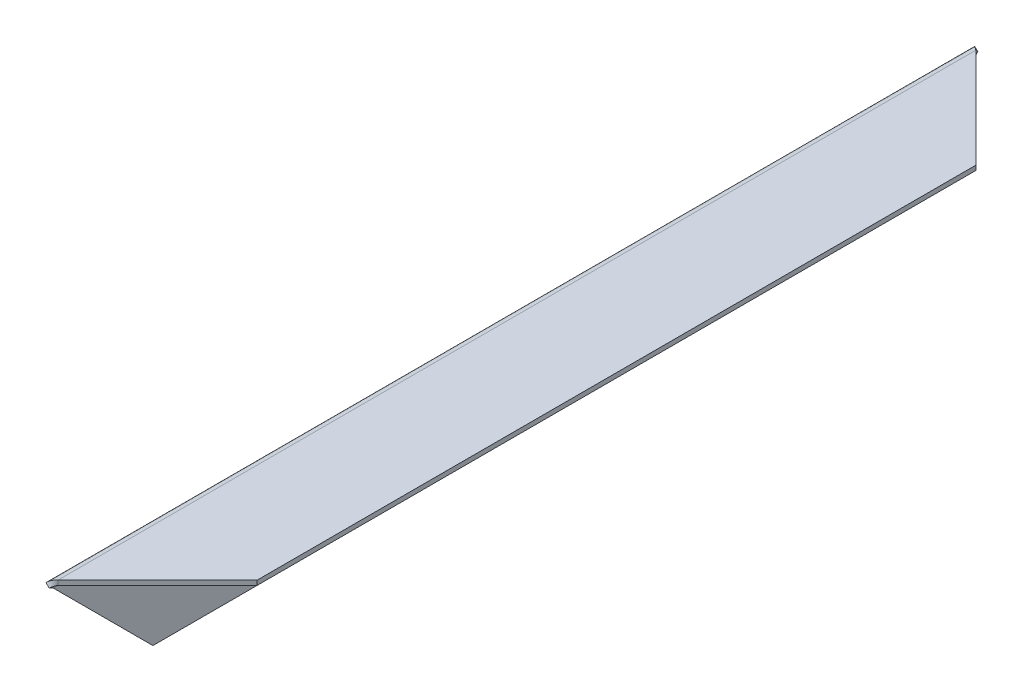
ISO-10303-21;
HEADER;
FILE_DESCRIPTION(('STEP AP214'),'2;1');
FILE_NAME('part.step','',(''),(''),'','','');
FILE_SCHEMA(('AUTOMOTIVE_DESIGN { 1 0 10303 214 1 1 1 1 }'));
ENDSEC;
DATA;
#1=APPLICATION_CONTEXT('core data for automotive mechanical design processes');
#2=APPLICATION_PROTOCOL_DEFINITION('international standard','automotive_design',2000,#1);
#3=PRODUCT_CONTEXT('',#1,'mechanical');
#4=PRODUCT('Part','Part','',(#3));
#5=PRODUCT_RELATED_PRODUCT_CATEGORY('part','',(#4));
#6=PRODUCT_DEFINITION_FORMATION('','',#4);
#7=PRODUCT_DEFINITION_CONTEXT('part definition',#1,'design');
#8=PRODUCT_DEFINITION('design','',#6,#7);
#9=PRODUCT_DEFINITION_SHAPE('','',#8);
#10=(LENGTH_UNIT() NAMED_UNIT(*) SI_UNIT(.MILLI.,.METRE.));
#11=(NAMED_UNIT(*) PLANE_ANGLE_UNIT() SI_UNIT($,.RADIAN.));
#12=(NAMED_UNIT(*) SI_UNIT($,.STERADIAN.) SOLID_ANGLE_UNIT());
#13=UNCERTAINTY_MEASURE_WITH_UNIT(LENGTH_MEASURE(1.E-05),#10,'distance_accuracy_value','');
#14=(GEOMETRIC_REPRESENTATION_CONTEXT(3) GLOBAL_UNCERTAINTY_ASSIGNED_CONTEXT((#13)) GLOBAL_UNIT_ASSIGNED_CONTEXT((#10,
#11,#12)) REPRESENTATION_CONTEXT('',''));
#15=CARTESIAN_POINT('',(0.,0.,0.));
#16=DIRECTION('',(0.,0.,1.));
#17=DIRECTION('',(1.,0.,0.));
#18=AXIS2_PLACEMENT_3D('',#15,#16,#17);
#19=CARTESIAN_POINT('',(-75.3461789999995,0.188336430725022,0.));
#20=DIRECTION('',(-1.,0.,0.));
#21=DIRECTION('',(0.,0.,1.));
#22=AXIS2_PLACEMENT_3D('',#19,#20,#21);
#23=PLANE('',#22);
#24=DIRECTION('',(0.,-0.707106781186615,-0.70710678118648));
#25=VECTOR('',#24,1.);
#26=CARTESIAN_POINT('',(-75.346179,74.7407654307376,74.5524289999984));
#27=LINE('',#26,#25);
#28=CARTESIAN_POINT('',(-75.346179,73.8729789999997,73.6846425692607));
#29=VERTEX_POINT('',#28);
#30=CARTESIAN_POINT('',(-75.3461789999999,57.8815154307375,57.6931790000015));
#31=VERTEX_POINT('',#30);
#32=EDGE_CURVE('E36',#29,#31,#27,.T.);
#33=ORIENTED_EDGE('',*,*,#32,.F.);
#34=DIRECTION('',(0.,0.,-1.));
#35=VECTOR('',#34,1.);
#36=CARTESIAN_POINT('',(-75.346179,73.8729789999997,0.));
#37=LINE('',#36,#35);
#38=CARTESIAN_POINT('',(-75.346179,73.8729789999998,-73.6846425692606));
#39=VERTEX_POINT('',#38);
#40=EDGE_CURVE('E29',#29,#39,#37,.T.);
#41=ORIENTED_EDGE('',*,*,#40,.T.);
#42=DIRECTION('',(0.,0.707106781186615,-0.70710678118648));
#43=VECTOR('',#42,1.);
#44=CARTESIAN_POINT('',(-75.346179,74.7407654307376,-74.5524289999983));
#45=LINE('',#44,#43);
#46=CARTESIAN_POINT('',(-75.3461789999999,57.8815154307376,-57.6931790000015));
#47=VERTEX_POINT('',#46);
#48=EDGE_CURVE('E44',#47,#39,#45,.T.);
#49=ORIENTED_EDGE('',*,*,#48,.F.);
#50=DIRECTION('',(0.,0.,-1.));
#51=VECTOR('',#50,1.);
#52=CARTESIAN_POINT('',(-75.3461789999999,57.8815154307375,57.6931790000015));
#53=LINE('',#52,#51);
#54=EDGE_CURVE('E414',#31,#47,#53,.T.);
#55=ORIENTED_EDGE('',*,*,#54,.F.);
#56=EDGE_LOOP('',(#33,#41,#49,#55));
#57=FACE_BOUND('',#56,.T.);
#58=ADVANCED_FACE('F17',(#57),#23,.T.);
#59=CARTESIAN_POINT('',(-74.6095790000001,74.7407654307376,74.5524289999984));
#60=DIRECTION('',(0.,0.70710678118648,-0.707106781186615));
#61=DIRECTION('',(0.,0.707106781186615,0.70710678118648));
#62=AXIS2_PLACEMENT_3D('',#59,#60,#61);
#63=PLANE('',#62);
#64=CARTESIAN_POINT('',(-75.346179,73.8729789999997,73.6846425692607));
#65=CARTESIAN_POINT('',(-74.6095790000001,73.8729789999997,73.6846425692607));
#66=B_SPLINE_CURVE_WITH_KNOTS('',1,(#64,#65),.UNSPECIFIED.,.F.,.F.,(2,2),(0.,1.),.UNSPECIFIED.);
#67=CARTESIAN_POINT('',(-74.6095790000001,73.8729789999997,73.6846425692607));
#68=VERTEX_POINT('',#67);
#69=EDGE_CURVE('E11',#29,#68,#66,.T.);
#70=ORIENTED_EDGE('',*,*,#69,.F.);
#71=ORIENTED_EDGE('',*,*,#32,.T.);
#72=DIRECTION('',(-1.,0.,0.));
#73=VECTOR('',#72,1.);
#74=CARTESIAN_POINT('',(-74.6095789999999,57.8815154307375,57.6931790000015));
#75=LINE('',#74,#73);
#76=CARTESIAN_POINT('',(-74.6095789999999,57.8815154307375,57.6931790000015));
#77=VERTEX_POINT('',#76);
#78=EDGE_CURVE('E457',#77,#31,#75,.T.);
#79=ORIENTED_EDGE('',*,*,#78,.F.);
#80=DIRECTION('',(0.,-0.707106781186615,-0.70710678118648));
#81=VECTOR('',#80,1.);
#82=CARTESIAN_POINT('',(-74.6095790000001,74.7407654307376,74.5524289999984));
#83=LINE('',#82,#81);
#84=EDGE_CURVE('E260',#68,#77,#83,.T.);
#85=ORIENTED_EDGE('',*,*,#84,.F.);
#86=EDGE_LOOP('',(#70,#71,#79,#85));
#87=FACE_BOUND('',#86,.T.);
#88=ADVANCED_FACE('F19',(#87),#63,.F.);
#89=CARTESIAN_POINT('',(-74.6095789999999,57.8815154307375,57.6931790000015));
#90=DIRECTION('',(0.,1.,0.));
#91=DIRECTION('',(0.,0.,1.));
#92=AXIS2_PLACEMENT_3D('',#89,#90,#91);
#93=PLANE('',#92);
#94=ORIENTED_EDGE('',*,*,#54,.T.);
#95=DIRECTION('',(-1.,0.,0.));
#96=VECTOR('',#95,1.);
#97=CARTESIAN_POINT('',(-74.6095789999999,57.8815154307376,-57.6931790000015));
#98=LINE('',#97,#96);
#99=CARTESIAN_POINT('',(-74.6095789999999,57.8815154307376,-57.6931790000015));
#100=VERTEX_POINT('',#99);
#101=EDGE_CURVE('E455',#100,#47,#98,.T.);
#102=ORIENTED_EDGE('',*,*,#101,.F.);
#103=DIRECTION('',(0.,0.,-1.));
#104=VECTOR('',#103,1.);
#105=CARTESIAN_POINT('',(-74.6095789999999,57.8815154307375,57.6931790000015));
#106=LINE('',#105,#104);
#107=EDGE_CURVE('E453',#77,#100,#106,.T.);
#108=ORIENTED_EDGE('',*,*,#107,.F.);
#109=ORIENTED_EDGE('',*,*,#78,.T.);
#110=EDGE_LOOP('',(#94,#102,#108,#109));
#111=FACE_BOUND('',#110,.T.);
#112=ADVANCED_FACE('F235',(#111),#93,.F.);
#113=CARTESIAN_POINT('',(-74.609579,74.7407654307376,-74.5524289999983));
#114=DIRECTION('',(0.,0.70710678118648,0.707106781186615));
#115=DIRECTION('',(0.,-0.707106781186615,0.70710678118648));
#116=AXIS2_PLACEMENT_3D('',#113,#114,#115);
#117=PLANE('',#116);
#118=CARTESIAN_POINT('',(-74.609579,73.8729789999998,-73.6846425692607));
#119=CARTESIAN_POINT('',(-75.346179,73.8729789999998,-73.6846425692607));
#120=B_SPLINE_CURVE_WITH_KNOTS('',1,(#118,#119),.UNSPECIFIED.,.F.,.F.,(2,2),(0.,1.),.UNSPECIFIED.);
#121=CARTESIAN_POINT('',(-74.609579,73.8729789999998,-73.6846425692607));
#122=VERTEX_POINT('',#121);
#123=EDGE_CURVE('E272',#122,#39,#120,.T.);
#124=ORIENTED_EDGE('',*,*,#123,.F.);
#125=DIRECTION('',(0.,0.707106781186615,-0.70710678118648));
#126=VECTOR('',#125,1.);
#127=CARTESIAN_POINT('',(-74.609579,74.7407654307376,-74.5524289999983));
#128=LINE('',#127,#126);
#129=EDGE_CURVE('E450',#100,#122,#128,.T.);
#130=ORIENTED_EDGE('',*,*,#129,.F.);
#131=ORIENTED_EDGE('',*,*,#101,.T.);
#132=ORIENTED_EDGE('',*,*,#48,.T.);
#133=EDGE_LOOP('',(#124,#130,#131,#132));
#134=FACE_BOUND('',#133,.T.);
#135=ADVANCED_FACE('F238',(#134),#117,.F.);
#136=CARTESIAN_POINT('',(-74.6095789999995,0.188336430725022,0.));
#137=DIRECTION('',(-1.,0.,0.));
#138=DIRECTION('',(0.,0.,1.));
#139=AXIS2_PLACEMENT_3D('',#136,#137,#138);
#140=PLANE('',#139);
#141=DIRECTION('',(0.,0.,-1.));
#142=VECTOR('',#141,1.);
#143=CARTESIAN_POINT('',(-74.609579,73.8729789999997,0.));
#144=LINE('',#143,#142);
#145=EDGE_CURVE('E451',#68,#122,#144,.T.);
#146=ORIENTED_EDGE('',*,*,#145,.F.);
#147=ORIENTED_EDGE('',*,*,#84,.T.);
#148=ORIENTED_EDGE('',*,*,#107,.T.);
#149=ORIENTED_EDGE('',*,*,#129,.T.);
#150=EDGE_LOOP('',(#146,#147,#148,#149));
#151=FACE_BOUND('',#150,.T.);
#152=ADVANCED_FACE('F240',(#151),#140,.F.);
#153=CARTESIAN_POINT('',(-57.8815154307379,74.6095789999998,57.6931790000015));
#154=DIRECTION('',(-1.,0.,0.));
#155=DIRECTION('',(0.,0.,-1.));
#156=AXIS2_PLACEMENT_3D('',#153,#154,#155);
#157=PLANE('',#156);
#158=DIRECTION('',(0.,0.,1.));
#159=VECTOR('',#158,1.);
#160=CARTESIAN_POINT('',(-57.8815154307379,75.3461789999998,57.6931790000015));
#161=LINE('',#160,#159);
#162=CARTESIAN_POINT('',(-57.8815154307379,75.3461789999998,-57.6931790000015));
#163=VERTEX_POINT('',#162);
#164=CARTESIAN_POINT('',(-57.8815154307379,75.3461789999998,57.6931790000015));
#165=VERTEX_POINT('',#164);
#166=EDGE_CURVE('E383',#163,#165,#161,.T.);
#167=ORIENTED_EDGE('',*,*,#166,.T.);
#168=DIRECTION('',(0.,1.,0.));
#169=VECTOR('',#168,1.);
#170=CARTESIAN_POINT('',(-57.8815154307379,74.6095789999998,57.6931790000015));
#171=LINE('',#170,#169);
#172=CARTESIAN_POINT('',(-57.8815154307379,74.6095789999998,57.6931790000015));
#173=VERTEX_POINT('',#172);
#174=EDGE_CURVE('E411',#173,#165,#171,.T.);
#175=ORIENTED_EDGE('',*,*,#174,.F.);
#176=DIRECTION('',(0.,0.,1.));
#177=VECTOR('',#176,1.);
#178=CARTESIAN_POINT('',(-57.8815154307379,74.6095789999998,57.6931790000015));
#179=LINE('',#178,#177);
#180=CARTESIAN_POINT('',(-57.8815154307379,74.6095789999998,-57.6931790000015));
#181=VERTEX_POINT('',#180);
#182=EDGE_CURVE('E202',#181,#173,#179,.T.);
#183=ORIENTED_EDGE('',*,*,#182,.F.);
#184=DIRECTION('',(0.,1.,0.));
#185=VECTOR('',#184,1.);
#186=CARTESIAN_POINT('',(-57.8815154307379,74.6095789999998,-57.6931790000015));
#187=LINE('',#186,#185);
#188=EDGE_CURVE('E200',#181,#163,#187,.T.);
#189=ORIENTED_EDGE('',*,*,#188,.T.);
#190=EDGE_LOOP('',(#167,#175,#183,#189));
#191=FACE_BOUND('',#190,.T.);
#192=ADVANCED_FACE('F242',(#191),#157,.F.);
#193=CARTESIAN_POINT('',(-149.29319443075,74.6095789999995,0.));
#194=DIRECTION('',(0.,1.,0.));
#195=DIRECTION('',(0.,0.,1.));
#196=AXIS2_PLACEMENT_3D('',#193,#194,#195);
#197=PLANE('',#196);
#198=DIRECTION('',(-0.707106781186614,0.,0.707106781186481));
#199=VECTOR('',#198,1.);
#200=CARTESIAN_POINT('',(-74.7407654307379,74.6095789999997,74.5524289999984));
#201=LINE('',#200,#199);
#202=CARTESIAN_POINT('',(-73.872979,74.6095789999997,73.6846425692607));
#203=VERTEX_POINT('',#202);
#204=EDGE_CURVE('E191',#173,#203,#201,.T.);
#205=ORIENTED_EDGE('',*,*,#204,.T.);
#206=DIRECTION('',(0.,0.,-1.));
#207=VECTOR('',#206,1.);
#208=CARTESIAN_POINT('',(-73.872979,74.6095789999997,0.));
#209=LINE('',#208,#207);
#210=CARTESIAN_POINT('',(-73.872979,74.6095789999998,-73.6846425692607));
#211=VERTEX_POINT('',#210);
#212=EDGE_CURVE('E133',#203,#211,#209,.T.);
#213=ORIENTED_EDGE('',*,*,#212,.T.);
#214=DIRECTION('',(0.707106781186614,0.,0.707106781186481));
#215=VECTOR('',#214,1.);
#216=CARTESIAN_POINT('',(-74.7407654307379,74.6095789999998,-74.5524289999983));
#217=LINE('',#216,#215);
#218=EDGE_CURVE('E188',#211,#181,#217,.T.);
#219=ORIENTED_EDGE('',*,*,#218,.T.);
#220=ORIENTED_EDGE('',*,*,#182,.T.);
#221=EDGE_LOOP('',(#205,#213,#219,#220));
#222=FACE_BOUND('',#221,.T.);
#223=ADVANCED_FACE('F187',(#222),#197,.F.);
#224=CARTESIAN_POINT('',(-74.7407654307379,74.6095789999998,-74.5524289999983));
#225=DIRECTION('',(-0.707106781186481,0.,0.707106781186614));
#226=DIRECTION('',(-0.707106781186614,0.,-0.707106781186481));
#227=AXIS2_PLACEMENT_3D('',#224,#225,#226);
#228=PLANE('',#227);
#229=ORIENTED_EDGE('',*,*,#218,.F.);
#230=CARTESIAN_POINT('',(-73.872979,75.3461789999998,-73.6846425692607));
#231=CARTESIAN_POINT('',(-73.872979,74.6095789999998,-73.6846425692607));
#232=B_SPLINE_CURVE_WITH_KNOTS('',1,(#230,#231),.UNSPECIFIED.,.F.,.F.,(2,2),(0.,1.),.UNSPECIFIED.);
#233=CARTESIAN_POINT('',(-73.872979,75.3461789999998,-73.6846425692606));
#234=VERTEX_POINT('',#233);
#235=EDGE_CURVE('E197',#211,#234,#232,.F.);
#236=ORIENTED_EDGE('',*,*,#235,.T.);
#237=DIRECTION('',(0.707106781186614,0.,0.707106781186481));
#238=VECTOR('',#237,1.);
#239=CARTESIAN_POINT('',(-74.7407654307379,75.3461789999998,-74.5524289999983));
#240=LINE('',#239,#238);
#241=EDGE_CURVE('E386',#234,#163,#240,.T.);
#242=ORIENTED_EDGE('',*,*,#241,.T.);
#243=ORIENTED_EDGE('',*,*,#188,.F.);
#244=EDGE_LOOP('',(#229,#236,#242,#243));
#245=FACE_BOUND('',#244,.T.);
#246=ADVANCED_FACE('F196',(#245),#228,.F.);
#247=CARTESIAN_POINT('',(-149.29319443075,75.3461789999995,0.));
#248=DIRECTION('',(0.,1.,0.));
#249=DIRECTION('',(0.,0.,1.));
#250=AXIS2_PLACEMENT_3D('',#247,#248,#249);
#251=PLANE('',#250);
#252=DIRECTION('',(0.,0.,-1.));
#253=VECTOR('',#252,1.);
#254=CARTESIAN_POINT('',(-73.872979,75.3461789999998,0.));
#255=LINE('',#254,#253);
#256=CARTESIAN_POINT('',(-73.8729790000001,75.3461789999997,73.6846425692607));
#257=VERTEX_POINT('',#256);
#258=EDGE_CURVE('E114',#257,#234,#255,.T.);
#259=ORIENTED_EDGE('',*,*,#258,.F.);
#260=DIRECTION('',(-0.707106781186614,0.,0.707106781186481));
#261=VECTOR('',#260,1.);
#262=CARTESIAN_POINT('',(-74.7407654307379,75.3461789999997,74.5524289999984));
#263=LINE('',#262,#261);
#264=EDGE_CURVE('E221',#165,#257,#263,.T.);
#265=ORIENTED_EDGE('',*,*,#264,.F.);
#266=ORIENTED_EDGE('',*,*,#166,.F.);
#267=ORIENTED_EDGE('',*,*,#241,.F.);
#268=EDGE_LOOP('',(#259,#265,#266,#267));
#269=FACE_BOUND('',#268,.T.);
#270=ADVANCED_FACE('F233',(#269),#251,.T.);
#271=CARTESIAN_POINT('',(-74.7407654307379,74.6095789999997,74.5524289999984));
#272=DIRECTION('',(-0.707106781186481,0.,-0.707106781186614));
#273=DIRECTION('',(0.707106781186614,0.,-0.707106781186481));
#274=AXIS2_PLACEMENT_3D('',#271,#272,#273);
#275=PLANE('',#274);
#276=ORIENTED_EDGE('',*,*,#264,.T.);
#277=CARTESIAN_POINT('',(-73.872979,74.6095789999997,73.6846425692607));
#278=CARTESIAN_POINT('',(-73.8729790000001,75.3461789999997,73.6846425692607));
#279=B_SPLINE_CURVE_WITH_KNOTS('',1,(#277,#278),.UNSPECIFIED.,.F.,.F.,(2,2),(0.,1.),.UNSPECIFIED.);
#280=EDGE_CURVE('E216',#257,#203,#279,.F.);
#281=ORIENTED_EDGE('',*,*,#280,.T.);
#282=ORIENTED_EDGE('',*,*,#204,.F.);
#283=ORIENTED_EDGE('',*,*,#174,.T.);
#284=EDGE_LOOP('',(#276,#281,#282,#283));
#285=FACE_BOUND('',#284,.T.);
#286=ADVANCED_FACE('F223',(#285),#275,.F.);
#287=CARTESIAN_POINT('',(-74.9146887100441,74.9146887100437,74.5524289999984));
#288=CARTESIAN_POINT('',(-75.0510639267768,74.778313493311,74.4077812391921));
#289=CARTESIAN_POINT('',(-75.1602411073236,74.6149104818821,74.2631668564191));
#290=CARTESIAN_POINT('',(-75.3078355472678,74.2585859832378,73.9739047128399));
#291=CARTESIAN_POINT('',(-75.346179,74.0658426810747,73.8292903300669));
#292=CARTESIAN_POINT('',(-75.346179,73.8729789999997,73.6846425692607));
#293=CARTESIAN_POINT('',(-74.3938338550221,74.3938338550217,74.5524289999984));
#294=CARTESIAN_POINT('',(-74.4620173784557,74.3256503315881,74.4077899046431));
#295=CARTESIAN_POINT('',(-74.5166100536618,74.2439447409409,74.2631668564191));
#296=CARTESIAN_POINT('',(-74.5904072736339,74.0657824916188,73.9739047128399));
#297=CARTESIAN_POINT('',(-74.6095790000001,73.9694050635699,73.829281664616));
#298=CARTESIAN_POINT('',(-74.6095790000001,73.8729789999997,73.6846425692607));
#299=B_SPLINE_SURFACE_WITH_KNOTS('',1,3,((#287,#288,#289,#290,#291,#292),(#293,#294,#295,#296,
#297,#298)),.UNSPECIFIED.,.F.,.F.,.F.,(2,2),(4,2,4),(0.,1.),(0.,0.5,1.),.UNSPECIFIED.);
#300=CARTESIAN_POINT('',(-74.9146887100441,74.9146887100437,74.5524289999984));
#301=CARTESIAN_POINT('',(-74.3938338550221,74.3938338550217,74.5524289999984));
#302=B_SPLINE_CURVE_WITH_KNOTS('',1,(#300,#301),.UNSPECIFIED.,.F.,.F.,(2,2),(0.,1.),.UNSPECIFIED.);
#303=CARTESIAN_POINT('',(-74.9146889457465,74.9146884743413,74.5524287499982));
#304=VERTEX_POINT('',#303);
#305=CARTESIAN_POINT('',(-74.3938338550221,74.3938338550217,74.5524289999984));
#306=VERTEX_POINT('',#305);
#307=EDGE_CURVE('E99',#304,#306,#302,.T.);
#308=CARTESIAN_POINT('',(-74.9146887100441,74.9146887100437,74.5524289999984));
#309=CARTESIAN_POINT('',(-75.0510639267768,74.778313493311,74.4077812391921));
#310=CARTESIAN_POINT('',(-75.1602411073236,74.6149104818821,74.2631668564191));
#311=CARTESIAN_POINT('',(-75.3078355472678,74.2585859832378,73.9739047128399));
#312=CARTESIAN_POINT('',(-75.346179,74.0658426810747,73.8292903300669));
#313=CARTESIAN_POINT('',(-75.346179,73.8729789999997,73.6846425692607));
#314=B_SPLINE_CURVE_WITH_KNOTS('',3,(#308,#309,#310,#311,#312,#313),.UNSPECIFIED.,.F.,.F.,(4,2,
4),(0.,0.5,1.),.UNSPECIFIED.);
#315=EDGE_CURVE('E266',#304,#29,#314,.T.);
#316=CARTESIAN_POINT('',(-74.6095790000001,73.8729789999997,73.6846425692607));
#317=CARTESIAN_POINT('',(-74.6095790000001,73.9694050635699,73.829281664616));
#318=CARTESIAN_POINT('',(-74.5904072736339,74.0657824916188,73.9739047128399));
#319=CARTESIAN_POINT('',(-74.5166100536618,74.2439447409409,74.2631668564191));
#320=CARTESIAN_POINT('',(-74.4620173784557,74.3256503315881,74.4077899046431));
#321=CARTESIAN_POINT('',(-74.3938338550221,74.3938338550217,74.5524289999984));
#322=B_SPLINE_CURVE_WITH_KNOTS('',3,(#316,#317,#318,#319,#320,#321),.UNSPECIFIED.,.F.,.F.,(4,2,
4),(0.,0.5,1.),.UNSPECIFIED.);
#323=EDGE_CURVE('E119',#306,#68,#322,.F.);
#324=ORIENTED_EDGE('',*,*,#307,.F.);
#325=ORIENTED_EDGE('',*,*,#315,.T.);
#326=ORIENTED_EDGE('',*,*,#69,.T.);
#327=ORIENTED_EDGE('',*,*,#323,.F.);
#328=EDGE_LOOP('',(#324,#325,#326,#327));
#329=FACE_BOUND('',#328,.T.);
#330=ADVANCED_FACE('F121',(#329),#299,.F.);
#331=CARTESIAN_POINT('',(-75.346179,73.8729789999998,-73.6846425692607));
#332=CARTESIAN_POINT('',(-75.346179,74.0658426810747,-73.8292903300669));
#333=CARTESIAN_POINT('',(-75.3078355472678,74.2585859832379,-73.9739047128399));
#334=CARTESIAN_POINT('',(-75.1602411073235,74.6149104818822,-74.2631668564191));
#335=CARTESIAN_POINT('',(-75.0510639267768,74.7783134933111,-74.4077812391921));
#336=CARTESIAN_POINT('',(-74.9146887100441,74.9146887100438,-74.5524289999983));
#337=CARTESIAN_POINT('',(-74.609579,73.8729789999998,-73.6846425692607));
#338=CARTESIAN_POINT('',(-74.609579,73.96940506357,-73.829281664616));
#339=CARTESIAN_POINT('',(-74.5904072736339,74.0657824916188,-73.9739047128399));
#340=CARTESIAN_POINT('',(-74.5166100536618,74.243944740941,-74.2631668564191));
#341=CARTESIAN_POINT('',(-74.4620173784557,74.3256503315882,-74.407789904643));
#342=CARTESIAN_POINT('',(-74.3938338550221,74.3938338550218,-74.5524289999983));
#343=B_SPLINE_SURFACE_WITH_KNOTS('',1,3,((#331,#332,#333,#334,#335,#336),(#337,#338,#339,#340,
#341,#342)),.UNSPECIFIED.,.F.,.F.,.F.,(2,2),(4,2,4),(0.,1.),(0.,0.5,1.),.UNSPECIFIED.);
#344=CARTESIAN_POINT('',(-75.346179,73.8729789999998,-73.6846425692607));
#345=CARTESIAN_POINT('',(-75.346179,74.0658426810747,-73.8292903300669));
#346=CARTESIAN_POINT('',(-75.3078355472678,74.2585859832379,-73.9739047128399));
#347=CARTESIAN_POINT('',(-75.1602411073235,74.6149104818822,-74.2631668564191));
#348=CARTESIAN_POINT('',(-75.0510639267768,74.7783134933111,-74.4077812391921));
#349=CARTESIAN_POINT('',(-74.9146887100441,74.9146887100438,-74.5524289999983));
#350=B_SPLINE_CURVE_WITH_KNOTS('',3,(#344,#345,#346,#347,#348,#349),.UNSPECIFIED.,.F.,.F.,(4,2,
4),(0.,0.5,1.),.UNSPECIFIED.);
#351=CARTESIAN_POINT('',(-74.9146889457464,74.9146884743413,-74.5524287499982));
#352=VERTEX_POINT('',#351);
#353=EDGE_CURVE('E269',#39,#352,#350,.T.);
#354=CARTESIAN_POINT('',(-74.9146887100441,74.9146887100438,-74.5524289999983));
#355=CARTESIAN_POINT('',(-74.3938338550221,74.3938338550218,-74.5524289999983));
#356=B_SPLINE_CURVE_WITH_KNOTS('',1,(#354,#355),.UNSPECIFIED.,.F.,.F.,(2,2),(0.,1.),.UNSPECIFIED.);
#357=CARTESIAN_POINT('',(-74.3938338550221,74.3938338550218,-74.5524289999983));
#358=VERTEX_POINT('',#357);
#359=EDGE_CURVE('E115',#352,#358,#356,.T.);
#360=CARTESIAN_POINT('',(-74.3938338550221,74.3938338550218,-74.5524289999983));
#361=CARTESIAN_POINT('',(-74.4620173784557,74.3256503315882,-74.407789904643));
#362=CARTESIAN_POINT('',(-74.5166100536618,74.243944740941,-74.2631668564191));
#363=CARTESIAN_POINT('',(-74.5904072736339,74.0657824916188,-73.9739047128399));
#364=CARTESIAN_POINT('',(-74.609579,73.96940506357,-73.829281664616));
#365=CARTESIAN_POINT('',(-74.609579,73.8729789999998,-73.6846425692607));
#366=B_SPLINE_CURVE_WITH_KNOTS('',3,(#360,#361,#362,#363,#364,#365),.UNSPECIFIED.,.F.,.F.,(4,2,
4),(0.,0.5,1.),.UNSPECIFIED.);
#367=EDGE_CURVE('E126',#122,#358,#366,.F.);
#368=ORIENTED_EDGE('',*,*,#123,.T.);
#369=ORIENTED_EDGE('',*,*,#353,.T.);
#370=ORIENTED_EDGE('',*,*,#359,.T.);
#371=ORIENTED_EDGE('',*,*,#367,.F.);
#372=EDGE_LOOP('',(#368,#369,#370,#371));
#373=FACE_BOUND('',#372,.T.);
#374=ADVANCED_FACE('F287',(#373),#343,.F.);
#375=CARTESIAN_POINT('',(-74.9146887100441,74.9146887100438,-74.5524289999983));
#376=CARTESIAN_POINT('',(-74.7783134933113,75.0510639267765,-74.4077812391921));
#377=CARTESIAN_POINT('',(-74.6149104818825,75.1602411073232,-74.2631668564191));
#378=CARTESIAN_POINT('',(-74.2585859832381,75.3078355472675,-73.9739047128399));
#379=CARTESIAN_POINT('',(-74.065842681075,75.3461789999998,-73.8292903300669));
#380=CARTESIAN_POINT('',(-73.872979,75.3461789999998,-73.6846425692607));
#381=CARTESIAN_POINT('',(-74.3938338550221,74.3938338550218,-74.5524289999983));
#382=CARTESIAN_POINT('',(-74.3256503315884,74.4620173784554,-74.407789904643));
#383=CARTESIAN_POINT('',(-74.2439447409412,74.5166100536615,-74.2631668564191));
#384=CARTESIAN_POINT('',(-74.0657824916191,74.5904072736337,-73.9739047128399));
#385=CARTESIAN_POINT('',(-73.9694050635702,74.6095789999998,-73.8292816646159));
#386=CARTESIAN_POINT('',(-73.872979,74.6095789999998,-73.6846425692607));
#387=B_SPLINE_SURFACE_WITH_KNOTS('',1,3,((#375,#376,#377,#378,#379,#380),(#381,#382,#383,#384,
#385,#386)),.UNSPECIFIED.,.F.,.F.,.F.,(2,2),(4,2,4),(0.,1.),(0.,0.5,1.),.UNSPECIFIED.);
#388=CARTESIAN_POINT('',(-74.9146887100441,74.9146887100438,-74.5524289999983));
#389=CARTESIAN_POINT('',(-74.7783134933113,75.0510639267765,-74.4077812391921));
#390=CARTESIAN_POINT('',(-74.6149104818825,75.1602411073232,-74.2631668564191));
#391=CARTESIAN_POINT('',(-74.2585859832381,75.3078355472675,-73.9739047128399));
#392=CARTESIAN_POINT('',(-74.065842681075,75.3461789999998,-73.8292903300669));
#393=CARTESIAN_POINT('',(-73.872979,75.3461789999998,-73.6846425692607));
#394=B_SPLINE_CURVE_WITH_KNOTS('',3,(#388,#389,#390,#391,#392,#393),.UNSPECIFIED.,.F.,.F.,(4,2,
4),(0.,0.5,1.),.UNSPECIFIED.);
#395=EDGE_CURVE('E370',#352,#234,#394,.T.);
#396=CARTESIAN_POINT('',(-73.872979,74.6095789999998,-73.6846425692607));
#397=CARTESIAN_POINT('',(-73.9694050635702,74.6095789999998,-73.8292816646159));
#398=CARTESIAN_POINT('',(-74.0657824916191,74.5904072736337,-73.9739047128399));
#399=CARTESIAN_POINT('',(-74.2439447409412,74.5166100536615,-74.2631668564191));
#400=CARTESIAN_POINT('',(-74.3256503315884,74.4620173784554,-74.407789904643));
#401=CARTESIAN_POINT('',(-74.3938338550221,74.3938338550218,-74.5524289999983));
#402=B_SPLINE_CURVE_WITH_KNOTS('',3,(#396,#397,#398,#399,#400,#401),.UNSPECIFIED.,.F.,.F.,(4,2,
4),(0.,0.5,1.),.UNSPECIFIED.);
#403=EDGE_CURVE('E134',#358,#211,#402,.F.);
#404=ORIENTED_EDGE('',*,*,#359,.F.);
#405=ORIENTED_EDGE('',*,*,#395,.T.);
#406=ORIENTED_EDGE('',*,*,#235,.F.);
#407=ORIENTED_EDGE('',*,*,#403,.F.);
#408=EDGE_LOOP('',(#404,#405,#406,#407));
#409=FACE_BOUND('',#408,.T.);
#410=ADVANCED_FACE('F157',(#409),#387,.F.);
#411=CARTESIAN_POINT('',(-73.8729790000001,75.3461789999997,73.6846425692607));
#412=CARTESIAN_POINT('',(-74.065842681075,75.3461789999997,73.8292903300669));
#413=CARTESIAN_POINT('',(-74.2585859832381,75.3078355472675,73.9739047128399));
#414=CARTESIAN_POINT('',(-74.6149104818825,75.1602411073232,74.2631668564191));
#415=CARTESIAN_POINT('',(-74.7783134933114,75.0510639267765,74.4077812391921));
#416=CARTESIAN_POINT('',(-74.9146887100441,74.9146887100437,74.5524289999984));
#417=CARTESIAN_POINT('',(-73.872979,74.6095789999997,73.6846425692607));
#418=CARTESIAN_POINT('',(-73.9694050635703,74.6095789999997,73.829281664616));
#419=CARTESIAN_POINT('',(-74.0657824916191,74.5904072736336,73.9739047128399));
#420=CARTESIAN_POINT('',(-74.2439447409413,74.5166100536615,74.2631668564191));
#421=CARTESIAN_POINT('',(-74.3256503315884,74.4620173784554,74.4077899046431));
#422=CARTESIAN_POINT('',(-74.3938338550221,74.3938338550217,74.5524289999984));
#423=B_SPLINE_SURFACE_WITH_KNOTS('',1,3,((#411,#412,#413,#414,#415,#416),(#417,#418,#419,#420,
#421,#422)),.UNSPECIFIED.,.F.,.F.,.F.,(2,2),(4,2,4),(0.,1.),(0.,0.5,1.),.UNSPECIFIED.);
#424=CARTESIAN_POINT('',(-73.8729790000001,75.3461789999997,73.6846425692607));
#425=CARTESIAN_POINT('',(-74.065842681075,75.3461789999997,73.8292903300669));
#426=CARTESIAN_POINT('',(-74.2585859832381,75.3078355472675,73.9739047128399));
#427=CARTESIAN_POINT('',(-74.6149104818825,75.1602411073232,74.2631668564191));
#428=CARTESIAN_POINT('',(-74.7783134933114,75.0510639267765,74.4077812391921));
#429=CARTESIAN_POINT('',(-74.9146887100441,74.9146887100437,74.5524289999984));
#430=B_SPLINE_CURVE_WITH_KNOTS('',3,(#424,#425,#426,#427,#428,#429),.UNSPECIFIED.,.F.,.F.,(4,2,
4),(0.,0.5,1.),.UNSPECIFIED.);
#431=EDGE_CURVE('E108',#257,#304,#430,.T.);
#432=CARTESIAN_POINT('',(-74.3938338550221,74.3938338550217,74.5524289999984));
#433=CARTESIAN_POINT('',(-74.3256503315884,74.4620173784554,74.4077899046431));
#434=CARTESIAN_POINT('',(-74.2439447409413,74.5166100536615,74.2631668564191));
#435=CARTESIAN_POINT('',(-74.0657824916191,74.5904072736336,73.9739047128399));
#436=CARTESIAN_POINT('',(-73.9694050635703,74.6095789999997,73.829281664616));
#437=CARTESIAN_POINT('',(-73.872979,74.6095789999997,73.6846425692607));
#438=B_SPLINE_CURVE_WITH_KNOTS('',3,(#432,#433,#434,#435,#436,#437),.UNSPECIFIED.,.F.,.F.,(4,2,
4),(0.,0.5,1.),.UNSPECIFIED.);
#439=EDGE_CURVE('E104',#203,#306,#438,.F.);
#440=ORIENTED_EDGE('',*,*,#431,.T.);
#441=ORIENTED_EDGE('',*,*,#307,.T.);
#442=ORIENTED_EDGE('',*,*,#439,.F.);
#443=ORIENTED_EDGE('',*,*,#280,.F.);
#444=EDGE_LOOP('',(#440,#441,#442,#443));
#445=FACE_BOUND('',#444,.T.);
#446=ADVANCED_FACE('F102',(#445),#423,.F.);
#447=CARTESIAN_POINT('',(-73.8729790000001,73.8729789999997,149.116777969203));
#448=DIRECTION('',(0.,0.,-1.));
#449=DIRECTION('',(1.,0.,0.));
#450=AXIS2_PLACEMENT_3D('',#447,#448,#449);
#451=CYLINDRICAL_SURFACE('',#450,0.7366);
#452=ORIENTED_EDGE('',*,*,#212,.F.);
#453=ORIENTED_EDGE('',*,*,#439,.T.);
#454=ORIENTED_EDGE('',*,*,#323,.T.);
#455=ORIENTED_EDGE('',*,*,#145,.T.);
#456=ORIENTED_EDGE('',*,*,#367,.T.);
#457=ORIENTED_EDGE('',*,*,#403,.T.);
#458=EDGE_LOOP('',(#452,#453,#454,#455,#456,#457));
#459=FACE_BOUND('',#458,.T.);
#460=ADVANCED_FACE('F130',(#459),#451,.F.);
#461=CARTESIAN_POINT('',(-73.8729790000001,73.8729789999997,149.116777969203));
#462=DIRECTION('',(0.,0.,-1.));
#463=DIRECTION('',(1.,0.,0.));
#464=AXIS2_PLACEMENT_3D('',#461,#462,#463);
#465=CYLINDRICAL_SURFACE('',#464,1.4732);
#466=ORIENTED_EDGE('',*,*,#258,.T.);
#467=ORIENTED_EDGE('',*,*,#395,.F.);
#468=ORIENTED_EDGE('',*,*,#353,.F.);
#469=ORIENTED_EDGE('',*,*,#40,.F.);
#470=ORIENTED_EDGE('',*,*,#315,.F.);
#471=ORIENTED_EDGE('',*,*,#431,.F.);
#472=EDGE_LOOP('',(#466,#467,#468,#469,#470,#471));
#473=FACE_BOUND('',#472,.T.);
#474=ADVANCED_FACE('F156',(#473),#465,.T.);
#475=CLOSED_SHELL('',(#58,#88,#112,#135,#152,#192,#223,#246,#270,#286,#330,#374,#410,#446,#460,#474));
#476=MANIFOLD_SOLID_BREP('B1',#475);
#477=ADVANCED_BREP_SHAPE_REPRESENTATION('',(#18,#476),#14);
#478=SHAPE_DEFINITION_REPRESENTATION(#9,#477);
ENDSEC;
END-ISO-10303-21;
